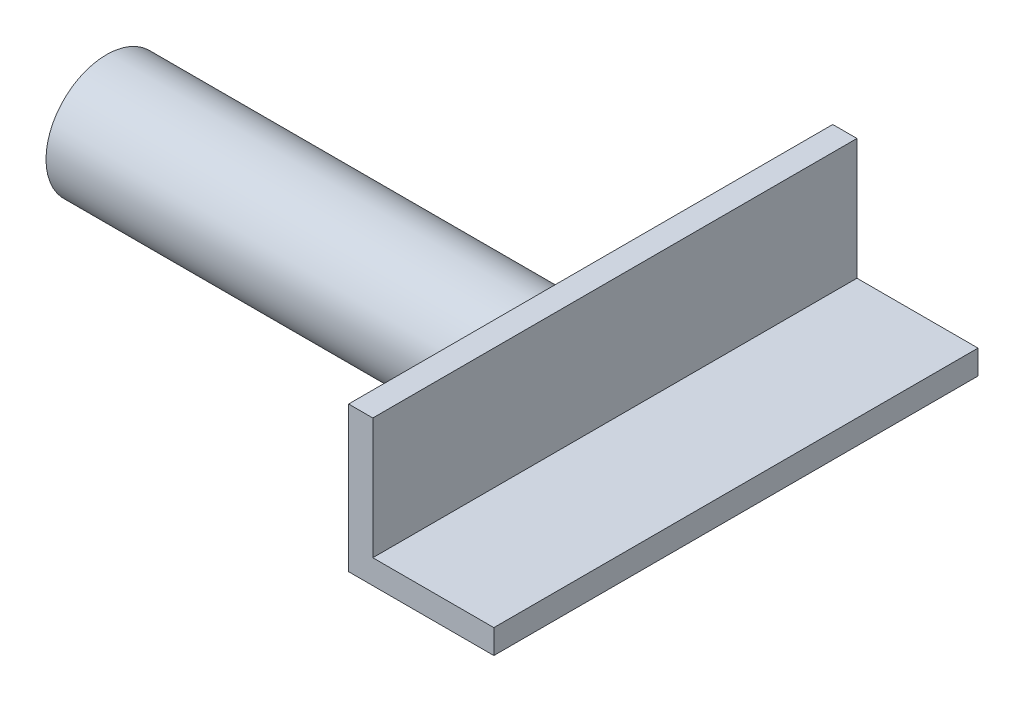
ISO-10303-21;
HEADER;
FILE_DESCRIPTION(('STEP AP214'),'2;1');
FILE_NAME('part.step','',(''),(''),'','','');
FILE_SCHEMA(('AUTOMOTIVE_DESIGN { 1 0 10303 214 1 1 1 1 }'));
ENDSEC;
DATA;
#1=APPLICATION_CONTEXT('core data for automotive mechanical design processes');
#2=APPLICATION_PROTOCOL_DEFINITION('international standard','automotive_design',2000,#1);
#3=PRODUCT_CONTEXT('',#1,'mechanical');
#4=PRODUCT('Part','Part','',(#3));
#5=PRODUCT_RELATED_PRODUCT_CATEGORY('part','',(#4));
#6=PRODUCT_DEFINITION_FORMATION('','',#4);
#7=PRODUCT_DEFINITION_CONTEXT('part definition',#1,'design');
#8=PRODUCT_DEFINITION('design','',#6,#7);
#9=PRODUCT_DEFINITION_SHAPE('','',#8);
#10=(LENGTH_UNIT() NAMED_UNIT(*) SI_UNIT(.MILLI.,.METRE.));
#11=(NAMED_UNIT(*) PLANE_ANGLE_UNIT() SI_UNIT($,.RADIAN.));
#12=(NAMED_UNIT(*) SI_UNIT($,.STERADIAN.) SOLID_ANGLE_UNIT());
#13=UNCERTAINTY_MEASURE_WITH_UNIT(LENGTH_MEASURE(1.E-05),#10,'distance_accuracy_value','');
#14=(GEOMETRIC_REPRESENTATION_CONTEXT(3) GLOBAL_UNCERTAINTY_ASSIGNED_CONTEXT((#13)) GLOBAL_UNIT_ASSIGNED_CONTEXT((#10,
#11,#12)) REPRESENTATION_CONTEXT('',''));
#15=CARTESIAN_POINT('',(0.,0.,0.));
#16=DIRECTION('',(0.,0.,1.));
#17=DIRECTION('',(1.,0.,0.));
#18=AXIS2_PLACEMENT_3D('',#15,#16,#17);
#19=CARTESIAN_POINT('',(0.,0.,40.));
#20=DIRECTION('',(1.,0.,0.));
#21=DIRECTION('',(0.,0.,-1.));
#22=AXIS2_PLACEMENT_3D('',#19,#20,#21);
#23=PLANE('',#22);
#24=CARTESIAN_POINT('',(0.,2.,20.));
#25=DIRECTION('',(-1.,0.,0.));
#26=DIRECTION('',(0.,0.,1.));
#27=AXIS2_PLACEMENT_3D('',#24,#25,#26);
#28=CIRCLE('',#27,5.);
#29=CARTESIAN_POINT('',(0.,0.,24.5825756949558));
#30=VERTEX_POINT('',#29);
#31=CARTESIAN_POINT('',(0.,0.,15.4174243050442));
#32=VERTEX_POINT('',#31);
#33=EDGE_CURVE('E11',#30,#32,#28,.T.);
#34=ORIENTED_EDGE('',*,*,#33,.F.);
#35=DIRECTION('',(0.,0.,-1.));
#36=VECTOR('',#35,1.);
#37=CARTESIAN_POINT('',(0.,0.,40.));
#38=LINE('',#37,#36);
#39=CARTESIAN_POINT('',(0.,0.,40.));
#40=VERTEX_POINT('',#39);
#41=EDGE_CURVE('E141',#40,#30,#38,.T.);
#42=ORIENTED_EDGE('',*,*,#41,.F.);
#43=DIRECTION('',(0.,-1.,0.));
#44=VECTOR('',#43,1.);
#45=CARTESIAN_POINT('',(0.,0.,40.));
#46=LINE('',#45,#44);
#47=CARTESIAN_POINT('',(0.,12.,40.));
#48=VERTEX_POINT('',#47);
#49=EDGE_CURVE('E57',#48,#40,#46,.T.);
#50=ORIENTED_EDGE('',*,*,#49,.F.);
#51=DIRECTION('',(0.,0.,-1.));
#52=VECTOR('',#51,1.);
#53=CARTESIAN_POINT('',(0.,12.,40.));
#54=LINE('',#53,#52);
#55=CARTESIAN_POINT('',(0.,12.,0.));
#56=VERTEX_POINT('',#55);
#57=EDGE_CURVE('E120',#48,#56,#54,.T.);
#58=ORIENTED_EDGE('',*,*,#57,.T.);
#59=DIRECTION('',(0.,-1.,0.));
#60=VECTOR('',#59,1.);
#61=CARTESIAN_POINT('',(0.,0.,0.));
#62=LINE('',#61,#60);
#63=CARTESIAN_POINT('',(0.,0.,0.));
#64=VERTEX_POINT('',#63);
#65=EDGE_CURVE('E138',#56,#64,#62,.T.);
#66=ORIENTED_EDGE('',*,*,#65,.T.);
#67=EDGE_CURVE('E83',#32,#64,#38,.T.);
#68=ORIENTED_EDGE('',*,*,#67,.F.);
#69=EDGE_LOOP('',(#34,#42,#50,#58,#66,#68));
#70=FACE_BOUND('',#69,.T.);
#71=ADVANCED_FACE('F33',(#70),#23,.F.);
#72=CARTESIAN_POINT('',(12.,0.,40.));
#73=DIRECTION('',(0.,1.,0.));
#74=DIRECTION('',(-1.,0.,0.));
#75=AXIS2_PLACEMENT_3D('',#72,#73,#74);
#76=PLANE('',#75);
#77=DIRECTION('',(1.,0.,0.));
#78=VECTOR('',#77,1.);
#79=CARTESIAN_POINT('',(12.,0.,0.));
#80=LINE('',#79,#78);
#81=CARTESIAN_POINT('',(12.,0.,0.));
#82=VERTEX_POINT('',#81);
#83=EDGE_CURVE('E128',#64,#82,#80,.T.);
#84=ORIENTED_EDGE('',*,*,#83,.T.);
#85=DIRECTION('',(0.,0.,-1.));
#86=VECTOR('',#85,1.);
#87=CARTESIAN_POINT('',(12.,0.,40.));
#88=LINE('',#87,#86);
#89=CARTESIAN_POINT('',(12.,0.,40.));
#90=VERTEX_POINT('',#89);
#91=EDGE_CURVE('E37',#90,#82,#88,.T.);
#92=ORIENTED_EDGE('',*,*,#91,.F.);
#93=DIRECTION('',(1.,0.,0.));
#94=VECTOR('',#93,1.);
#95=CARTESIAN_POINT('',(12.,0.,40.));
#96=LINE('',#95,#94);
#97=EDGE_CURVE('E140',#40,#90,#96,.T.);
#98=ORIENTED_EDGE('',*,*,#97,.F.);
#99=ORIENTED_EDGE('',*,*,#41,.T.);
#100=EDGE_CURVE('E143',#30,#32,#38,.T.);
#101=ORIENTED_EDGE('',*,*,#100,.T.);
#102=ORIENTED_EDGE('',*,*,#67,.T.);
#103=EDGE_LOOP('',(#84,#92,#98,#99,#101,#102));
#104=FACE_BOUND('',#103,.T.);
#105=ADVANCED_FACE('F35',(#104),#76,.F.);
#106=CARTESIAN_POINT('',(12.,2.,40.));
#107=DIRECTION('',(-1.,0.,0.));
#108=DIRECTION('',(0.,0.,1.));
#109=AXIS2_PLACEMENT_3D('',#106,#107,#108);
#110=PLANE('',#109);
#111=DIRECTION('',(0.,1.,0.));
#112=VECTOR('',#111,1.);
#113=CARTESIAN_POINT('',(12.,2.,0.));
#114=LINE('',#113,#112);
#115=CARTESIAN_POINT('',(12.,2.,0.));
#116=VERTEX_POINT('',#115);
#117=EDGE_CURVE('E130',#82,#116,#114,.T.);
#118=ORIENTED_EDGE('',*,*,#117,.T.);
#119=DIRECTION('',(0.,0.,-1.));
#120=VECTOR('',#119,1.);
#121=CARTESIAN_POINT('',(12.,2.,40.));
#122=LINE('',#121,#120);
#123=CARTESIAN_POINT('',(12.,2.,40.));
#124=VERTEX_POINT('',#123);
#125=EDGE_CURVE('E145',#124,#116,#122,.T.);
#126=ORIENTED_EDGE('',*,*,#125,.F.);
#127=DIRECTION('',(0.,1.,0.));
#128=VECTOR('',#127,1.);
#129=CARTESIAN_POINT('',(12.,2.,40.));
#130=LINE('',#129,#128);
#131=EDGE_CURVE('E92',#90,#124,#130,.T.);
#132=ORIENTED_EDGE('',*,*,#131,.F.);
#133=ORIENTED_EDGE('',*,*,#91,.T.);
#134=EDGE_LOOP('',(#118,#126,#132,#133));
#135=FACE_BOUND('',#134,.T.);
#136=ADVANCED_FACE('F150',(#135),#110,.F.);
#137=CARTESIAN_POINT('',(2.,2.,40.));
#138=DIRECTION('',(0.,-1.,0.));
#139=DIRECTION('',(0.,0.,-1.));
#140=AXIS2_PLACEMENT_3D('',#137,#138,#139);
#141=PLANE('',#140);
#142=DIRECTION('',(-1.,0.,0.));
#143=VECTOR('',#142,1.);
#144=CARTESIAN_POINT('',(2.,2.,0.));
#145=LINE('',#144,#143);
#146=CARTESIAN_POINT('',(2.,2.,0.));
#147=VERTEX_POINT('',#146);
#148=EDGE_CURVE('E133',#116,#147,#145,.T.);
#149=ORIENTED_EDGE('',*,*,#148,.T.);
#150=DIRECTION('',(0.,0.,-1.));
#151=VECTOR('',#150,1.);
#152=CARTESIAN_POINT('',(2.,2.,40.));
#153=LINE('',#152,#151);
#154=CARTESIAN_POINT('',(2.,2.,40.));
#155=VERTEX_POINT('',#154);
#156=EDGE_CURVE('E119',#155,#147,#153,.T.);
#157=ORIENTED_EDGE('',*,*,#156,.F.);
#158=DIRECTION('',(-1.,0.,0.));
#159=VECTOR('',#158,1.);
#160=CARTESIAN_POINT('',(2.,2.,40.));
#161=LINE('',#160,#159);
#162=EDGE_CURVE('E107',#124,#155,#161,.T.);
#163=ORIENTED_EDGE('',*,*,#162,.F.);
#164=ORIENTED_EDGE('',*,*,#125,.T.);
#165=EDGE_LOOP('',(#149,#157,#163,#164));
#166=FACE_BOUND('',#165,.T.);
#167=ADVANCED_FACE('F156',(#166),#141,.F.);
#168=CARTESIAN_POINT('',(2.,12.,40.));
#169=DIRECTION('',(-1.,0.,0.));
#170=DIRECTION('',(0.,-1.,0.));
#171=AXIS2_PLACEMENT_3D('',#168,#169,#170);
#172=PLANE('',#171);
#173=DIRECTION('',(0.,1.,0.));
#174=VECTOR('',#173,1.);
#175=CARTESIAN_POINT('',(2.,12.,0.));
#176=LINE('',#175,#174);
#177=CARTESIAN_POINT('',(2.,12.,0.));
#178=VERTEX_POINT('',#177);
#179=EDGE_CURVE('E116',#147,#178,#176,.T.);
#180=ORIENTED_EDGE('',*,*,#179,.T.);
#181=DIRECTION('',(0.,0.,-1.));
#182=VECTOR('',#181,1.);
#183=CARTESIAN_POINT('',(2.,12.,40.));
#184=LINE('',#183,#182);
#185=CARTESIAN_POINT('',(2.,12.,40.));
#186=VERTEX_POINT('',#185);
#187=EDGE_CURVE('E113',#186,#178,#184,.T.);
#188=ORIENTED_EDGE('',*,*,#187,.F.);
#189=DIRECTION('',(0.,1.,0.));
#190=VECTOR('',#189,1.);
#191=CARTESIAN_POINT('',(2.,12.,40.));
#192=LINE('',#191,#190);
#193=EDGE_CURVE('E100',#155,#186,#192,.T.);
#194=ORIENTED_EDGE('',*,*,#193,.F.);
#195=ORIENTED_EDGE('',*,*,#156,.T.);
#196=EDGE_LOOP('',(#180,#188,#194,#195));
#197=FACE_BOUND('',#196,.T.);
#198=ADVANCED_FACE('F114',(#197),#172,.F.);
#199=CARTESIAN_POINT('',(0.,12.,40.));
#200=DIRECTION('',(0.,-1.,0.));
#201=DIRECTION('',(0.,0.,-1.));
#202=AXIS2_PLACEMENT_3D('',#199,#200,#201);
#203=PLANE('',#202);
#204=DIRECTION('',(-1.,0.,0.));
#205=VECTOR('',#204,1.);
#206=CARTESIAN_POINT('',(0.,12.,0.));
#207=LINE('',#206,#205);
#208=EDGE_CURVE('E136',#178,#56,#207,.T.);
#209=ORIENTED_EDGE('',*,*,#208,.T.);
#210=ORIENTED_EDGE('',*,*,#57,.F.);
#211=DIRECTION('',(-1.,0.,0.));
#212=VECTOR('',#211,1.);
#213=CARTESIAN_POINT('',(0.,12.,40.));
#214=LINE('',#213,#212);
#215=EDGE_CURVE('E104',#186,#48,#214,.T.);
#216=ORIENTED_EDGE('',*,*,#215,.F.);
#217=ORIENTED_EDGE('',*,*,#187,.T.);
#218=EDGE_LOOP('',(#209,#210,#216,#217));
#219=FACE_BOUND('',#218,.T.);
#220=ADVANCED_FACE('F122',(#219),#203,.F.);
#221=CARTESIAN_POINT('',(0.,0.,40.));
#222=DIRECTION('',(0.,0.,-1.));
#223=DIRECTION('',(-1.,0.,0.));
#224=AXIS2_PLACEMENT_3D('',#221,#222,#223);
#225=PLANE('',#224);
#226=ORIENTED_EDGE('',*,*,#97,.T.);
#227=ORIENTED_EDGE('',*,*,#131,.T.);
#228=ORIENTED_EDGE('',*,*,#162,.T.);
#229=ORIENTED_EDGE('',*,*,#193,.T.);
#230=ORIENTED_EDGE('',*,*,#215,.T.);
#231=ORIENTED_EDGE('',*,*,#49,.T.);
#232=EDGE_LOOP('',(#226,#227,#228,#229,#230,#231));
#233=FACE_BOUND('',#232,.T.);
#234=ADVANCED_FACE('F102',(#233),#225,.F.);
#235=CARTESIAN_POINT('',(0.,0.,0.));
#236=DIRECTION('',(0.,0.,-1.));
#237=DIRECTION('',(-1.,0.,0.));
#238=AXIS2_PLACEMENT_3D('',#235,#236,#237);
#239=PLANE('',#238);
#240=ORIENTED_EDGE('',*,*,#83,.F.);
#241=ORIENTED_EDGE('',*,*,#65,.F.);
#242=ORIENTED_EDGE('',*,*,#208,.F.);
#243=ORIENTED_EDGE('',*,*,#179,.F.);
#244=ORIENTED_EDGE('',*,*,#148,.F.);
#245=ORIENTED_EDGE('',*,*,#117,.F.);
#246=EDGE_LOOP('',(#240,#241,#242,#243,#244,#245));
#247=FACE_BOUND('',#246,.T.);
#248=ADVANCED_FACE('F155',(#247),#239,.T.);
#249=CARTESIAN_POINT('',(-40.,2.,20.));
#250=DIRECTION('',(1.,0.,0.));
#251=DIRECTION('',(0.,0.,-1.));
#252=AXIS2_PLACEMENT_3D('',#249,#250,#251);
#253=CYLINDRICAL_SURFACE('',#252,5.);
#254=CARTESIAN_POINT('',(-40.,2.,20.));
#255=DIRECTION('',(-1.,0.,0.));
#256=DIRECTION('',(0.,0.,1.));
#257=AXIS2_PLACEMENT_3D('',#254,#255,#256);
#258=CIRCLE('',#257,5.);
#259=CARTESIAN_POINT('',(-40.,2.,25.));
#260=VERTEX_POINT('',#259);
#261=EDGE_CURVE('E131',#260,#260,#258,.T.);
#262=ORIENTED_EDGE('',*,*,#261,.F.);
#263=EDGE_LOOP('',(#262));
#264=FACE_BOUND('',#263,.T.);
#265=EDGE_CURVE('E43',#32,#30,#28,.T.);
#266=ORIENTED_EDGE('',*,*,#265,.T.);
#267=ORIENTED_EDGE('',*,*,#33,.T.);
#268=EDGE_LOOP('',(#266,#267));
#269=FACE_BOUND('',#268,.T.);
#270=ADVANCED_FACE('F166',(#264,#269),#253,.T.);
#271=CARTESIAN_POINT('',(-40.,2.,20.));
#272=DIRECTION('',(-1.,0.,0.));
#273=DIRECTION('',(0.,0.,1.));
#274=AXIS2_PLACEMENT_3D('',#271,#272,#273);
#275=PLANE('',#274);
#276=ORIENTED_EDGE('',*,*,#261,.T.);
#277=EDGE_LOOP('',(#276));
#278=FACE_BOUND('',#277,.T.);
#279=ADVANCED_FACE('F164',(#278),#275,.T.);
#280=CARTESIAN_POINT('',(0.,2.,20.));
#281=DIRECTION('',(-1.,0.,0.));
#282=DIRECTION('',(0.,0.,1.));
#283=AXIS2_PLACEMENT_3D('',#280,#281,#282);
#284=PLANE('',#283);
#285=ORIENTED_EDGE('',*,*,#100,.F.);
#286=ORIENTED_EDGE('',*,*,#265,.F.);
#287=EDGE_LOOP('',(#285,#286));
#288=FACE_BOUND('',#287,.T.);
#289=ADVANCED_FACE('F173',(#288),#284,.F.);
#290=CLOSED_SHELL('',(#71,#105,#136,#167,#198,#220,#234,#248,#270,#279,#289));
#291=MANIFOLD_SOLID_BREP('B2',#290);
#292=ADVANCED_BREP_SHAPE_REPRESENTATION('',(#18,#291),#14);
#293=SHAPE_DEFINITION_REPRESENTATION(#9,#292);
ENDSEC;
END-ISO-10303-21;
